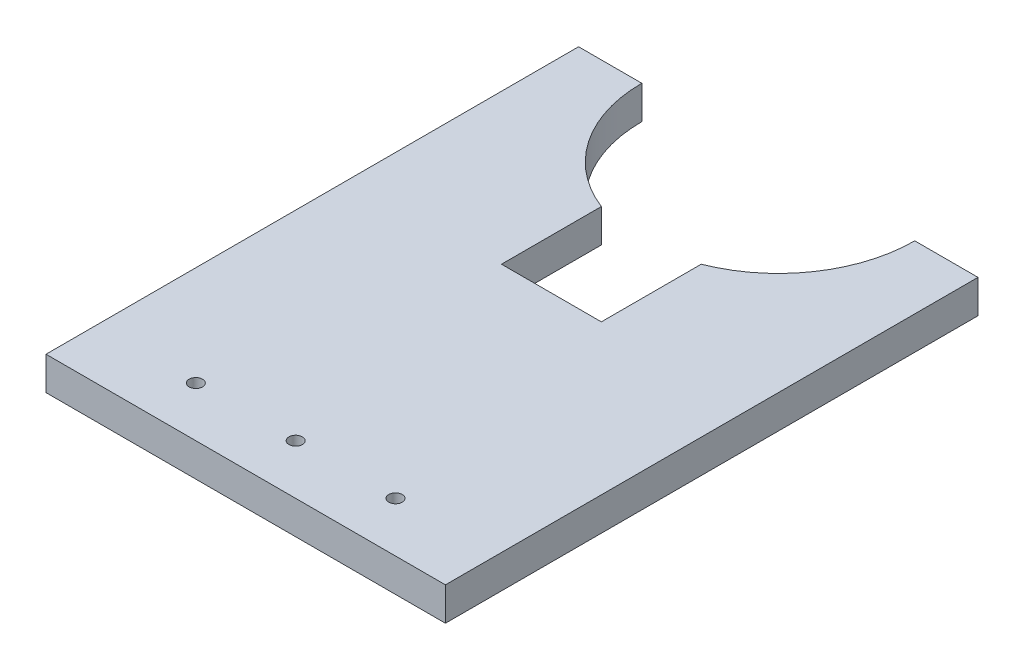
ISO-10303-21;
HEADER;
FILE_DESCRIPTION(('STEP AP214'),'2;1');
FILE_NAME('part.step','',(''),(''),'','','');
FILE_SCHEMA(('AUTOMOTIVE_DESIGN { 1 0 10303 214 1 1 1 1 }'));
ENDSEC;
DATA;
#1=APPLICATION_CONTEXT('core data for automotive mechanical design processes');
#2=APPLICATION_PROTOCOL_DEFINITION('international standard','automotive_design',2000,#1);
#3=PRODUCT_CONTEXT('',#1,'mechanical');
#4=PRODUCT('Part','Part','',(#3));
#5=PRODUCT_RELATED_PRODUCT_CATEGORY('part','',(#4));
#6=PRODUCT_DEFINITION_FORMATION('','',#4);
#7=PRODUCT_DEFINITION_CONTEXT('part definition',#1,'design');
#8=PRODUCT_DEFINITION('design','',#6,#7);
#9=PRODUCT_DEFINITION_SHAPE('','',#8);
#10=(LENGTH_UNIT() NAMED_UNIT(*) SI_UNIT(.MILLI.,.METRE.));
#11=(NAMED_UNIT(*) PLANE_ANGLE_UNIT() SI_UNIT($,.RADIAN.));
#12=(NAMED_UNIT(*) SI_UNIT($,.STERADIAN.) SOLID_ANGLE_UNIT());
#13=UNCERTAINTY_MEASURE_WITH_UNIT(LENGTH_MEASURE(1.E-05),#10,'distance_accuracy_value','');
#14=(GEOMETRIC_REPRESENTATION_CONTEXT(3) GLOBAL_UNCERTAINTY_ASSIGNED_CONTEXT((#13)) GLOBAL_UNIT_ASSIGNED_CONTEXT((#10,
#11,#12)) REPRESENTATION_CONTEXT('',''));
#15=CARTESIAN_POINT('',(0.,0.,0.));
#16=DIRECTION('',(0.,0.,1.));
#17=DIRECTION('',(1.,0.,0.));
#18=AXIS2_PLACEMENT_3D('',#15,#16,#17);
#19=CARTESIAN_POINT('',(0.,12.7,0.));
#20=DIRECTION('',(0.,1.,0.));
#21=DIRECTION('',(0.,0.,1.));
#22=AXIS2_PLACEMENT_3D('',#19,#20,#21);
#23=PLANE('',#22);
#24=CARTESIAN_POINT('',(0.,12.7,-19.05));
#25=DIRECTION('',(0.,1.,0.));
#26=DIRECTION('',(0.,0.,1.));
#27=AXIS2_PLACEMENT_3D('',#24,#25,#26);
#28=CIRCLE('',#27,2.5654);
#29=CARTESIAN_POINT('',(0.,12.7,-16.4846));
#30=VERTEX_POINT('',#29);
#31=EDGE_CURVE('E139',#30,#30,#28,.F.);
#32=ORIENTED_EDGE('',*,*,#31,.T.);
#33=EDGE_LOOP('',(#32));
#34=FACE_BOUND('',#33,.T.);
#35=CARTESIAN_POINT('',(38.1,12.7,-19.05));
#36=DIRECTION('',(0.,1.,0.));
#37=DIRECTION('',(0.,0.,1.));
#38=AXIS2_PLACEMENT_3D('',#35,#36,#37);
#39=CIRCLE('',#38,2.5654);
#40=CARTESIAN_POINT('',(38.1,12.7,-16.4846));
#41=VERTEX_POINT('',#40);
#42=EDGE_CURVE('E191',#41,#41,#39,.F.);
#43=ORIENTED_EDGE('',*,*,#42,.T.);
#44=EDGE_LOOP('',(#43));
#45=FACE_BOUND('',#44,.T.);
#46=CARTESIAN_POINT('',(-38.1,12.7,-19.05));
#47=DIRECTION('',(0.,1.,0.));
#48=DIRECTION('',(0.,0.,1.));
#49=AXIS2_PLACEMENT_3D('',#46,#47,#48);
#50=CIRCLE('',#49,2.5654);
#51=CARTESIAN_POINT('',(-38.1,12.7,-16.4846));
#52=VERTEX_POINT('',#51);
#53=EDGE_CURVE('E194',#52,#52,#50,.F.);
#54=ORIENTED_EDGE('',*,*,#53,.T.);
#55=EDGE_LOOP('',(#54));
#56=FACE_BOUND('',#55,.T.);
#57=DIRECTION('',(0.,0.,1.));
#58=VECTOR('',#57,1.);
#59=CARTESIAN_POINT('',(-76.2,12.7,-203.2));
#60=LINE('',#59,#58);
#61=CARTESIAN_POINT('',(-76.2,12.7,0.));
#62=VERTEX_POINT('',#61);
#63=CARTESIAN_POINT('',(-76.2,12.7,-203.2));
#64=VERTEX_POINT('',#63);
#65=EDGE_CURVE('E145',#62,#64,#60,.F.);
#66=ORIENTED_EDGE('',*,*,#65,.F.);
#67=DIRECTION('',(1.,0.,0.));
#68=VECTOR('',#67,1.);
#69=CARTESIAN_POINT('',(-76.2,12.7,0.));
#70=LINE('',#69,#68);
#71=CARTESIAN_POINT('',(76.2,12.7,0.));
#72=VERTEX_POINT('',#71);
#73=EDGE_CURVE('E157',#72,#62,#70,.F.);
#74=ORIENTED_EDGE('',*,*,#73,.F.);
#75=DIRECTION('',(0.,0.,-1.));
#76=VECTOR('',#75,1.);
#77=CARTESIAN_POINT('',(76.2,12.7,0.));
#78=LINE('',#77,#76);
#79=CARTESIAN_POINT('',(76.2,12.7,-203.2));
#80=VERTEX_POINT('',#79);
#81=EDGE_CURVE('E134',#80,#72,#78,.F.);
#82=ORIENTED_EDGE('',*,*,#81,.F.);
#83=DIRECTION('',(-1.,0.,0.));
#84=VECTOR('',#83,1.);
#85=CARTESIAN_POINT('',(76.2,12.7,-203.2));
#86=LINE('',#85,#84);
#87=CARTESIAN_POINT('',(52.07,12.7,-203.2));
#88=VERTEX_POINT('',#87);
#89=EDGE_CURVE('E90',#88,#80,#86,.F.);
#90=ORIENTED_EDGE('',*,*,#89,.F.);
#91=CARTESIAN_POINT('',(0.,12.7,-203.2));
#92=DIRECTION('',(0.,1.,0.));
#93=DIRECTION('',(0.,0.,1.));
#94=AXIS2_PLACEMENT_3D('',#91,#92,#93);
#95=CIRCLE('',#94,52.07);
#96=CARTESIAN_POINT('',(19.05,12.7,-154.739888568019));
#97=VERTEX_POINT('',#96);
#98=EDGE_CURVE('E19',#88,#97,#95,.F.);
#99=ORIENTED_EDGE('',*,*,#98,.T.);
#100=DIRECTION('',(0.,0.,1.));
#101=VECTOR('',#100,1.);
#102=CARTESIAN_POINT('',(19.05,12.7,-154.739888568019));
#103=LINE('',#102,#101);
#104=CARTESIAN_POINT('',(19.05,12.7,-116.639888568019));
#105=VERTEX_POINT('',#104);
#106=EDGE_CURVE('E96',#105,#97,#103,.F.);
#107=ORIENTED_EDGE('',*,*,#106,.F.);
#108=DIRECTION('',(-1.,0.,0.));
#109=VECTOR('',#108,1.);
#110=CARTESIAN_POINT('',(19.05,12.7,-116.639888568019));
#111=LINE('',#110,#109);
#112=CARTESIAN_POINT('',(-19.05,12.7,-116.639888568019));
#113=VERTEX_POINT('',#112);
#114=EDGE_CURVE('E113',#113,#105,#111,.F.);
#115=ORIENTED_EDGE('',*,*,#114,.F.);
#116=DIRECTION('',(0.,0.,-1.));
#117=VECTOR('',#116,1.);
#118=CARTESIAN_POINT('',(-19.05,12.7,-116.639888568019));
#119=LINE('',#118,#117);
#120=CARTESIAN_POINT('',(-19.05,12.7,-154.739888568019));
#121=VERTEX_POINT('',#120);
#122=EDGE_CURVE('E161',#121,#113,#119,.F.);
#123=ORIENTED_EDGE('',*,*,#122,.F.);
#124=CARTESIAN_POINT('',(0.,12.7,-203.2));
#125=DIRECTION('',(0.,1.,0.));
#126=DIRECTION('',(0.,0.,1.));
#127=AXIS2_PLACEMENT_3D('',#124,#125,#126);
#128=CIRCLE('',#127,52.07);
#129=CARTESIAN_POINT('',(-52.07,12.7,-203.2));
#130=VERTEX_POINT('',#129);
#131=EDGE_CURVE('E151',#121,#130,#128,.F.);
#132=ORIENTED_EDGE('',*,*,#131,.T.);
#133=DIRECTION('',(-1.,0.,0.));
#134=VECTOR('',#133,1.);
#135=CARTESIAN_POINT('',(-52.07,12.7,-203.2));
#136=LINE('',#135,#134);
#137=EDGE_CURVE('E149',#64,#130,#136,.F.);
#138=ORIENTED_EDGE('',*,*,#137,.F.);
#139=EDGE_LOOP('',(#66,#74,#82,#90,#99,#107,#115,#123,#132,#138));
#140=FACE_BOUND('',#139,.T.);
#141=ADVANCED_FACE('F16',(#34,#45,#56,#140),#23,.T.);
#142=CARTESIAN_POINT('',(-76.2,0.,0.));
#143=DIRECTION('',(0.,0.,1.));
#144=DIRECTION('',(1.,0.,0.));
#145=AXIS2_PLACEMENT_3D('',#142,#143,#144);
#146=PLANE('',#145);
#147=DIRECTION('',(0.,1.,0.));
#148=VECTOR('',#147,1.);
#149=CARTESIAN_POINT('',(-76.2,0.,0.));
#150=LINE('',#149,#148);
#151=CARTESIAN_POINT('',(-76.2,0.,0.));
#152=VERTEX_POINT('',#151);
#153=EDGE_CURVE('E142',#152,#62,#150,.T.);
#154=ORIENTED_EDGE('',*,*,#153,.F.);
#155=DIRECTION('',(1.,0.,0.));
#156=VECTOR('',#155,1.);
#157=CARTESIAN_POINT('',(0.,0.,0.));
#158=LINE('',#157,#156);
#159=CARTESIAN_POINT('',(76.2,0.,0.));
#160=VERTEX_POINT('',#159);
#161=EDGE_CURVE('E129',#152,#160,#158,.T.);
#162=ORIENTED_EDGE('',*,*,#161,.T.);
#163=DIRECTION('',(0.,1.,0.));
#164=VECTOR('',#163,1.);
#165=CARTESIAN_POINT('',(76.2,0.,0.));
#166=LINE('',#165,#164);
#167=EDGE_CURVE('E132',#72,#160,#166,.F.);
#168=ORIENTED_EDGE('',*,*,#167,.F.);
#169=ORIENTED_EDGE('',*,*,#73,.T.);
#170=EDGE_LOOP('',(#154,#162,#168,#169));
#171=FACE_BOUND('',#170,.T.);
#172=ADVANCED_FACE('F253',(#171),#146,.T.);
#173=CARTESIAN_POINT('',(76.2,0.,0.));
#174=DIRECTION('',(1.,0.,0.));
#175=DIRECTION('',(0.,0.,-1.));
#176=AXIS2_PLACEMENT_3D('',#173,#174,#175);
#177=PLANE('',#176);
#178=ORIENTED_EDGE('',*,*,#167,.T.);
#179=DIRECTION('',(0.,0.,1.));
#180=VECTOR('',#179,1.);
#181=CARTESIAN_POINT('',(76.2,0.,0.));
#182=LINE('',#181,#180);
#183=CARTESIAN_POINT('',(76.2,0.,-203.2));
#184=VERTEX_POINT('',#183);
#185=EDGE_CURVE('E125',#160,#184,#182,.F.);
#186=ORIENTED_EDGE('',*,*,#185,.T.);
#187=DIRECTION('',(0.,1.,0.));
#188=VECTOR('',#187,1.);
#189=CARTESIAN_POINT('',(76.2,0.,-203.2));
#190=LINE('',#189,#188);
#191=EDGE_CURVE('E121',#80,#184,#190,.F.);
#192=ORIENTED_EDGE('',*,*,#191,.F.);
#193=ORIENTED_EDGE('',*,*,#81,.T.);
#194=EDGE_LOOP('',(#178,#186,#192,#193));
#195=FACE_BOUND('',#194,.T.);
#196=ADVANCED_FACE('F258',(#195),#177,.T.);
#197=CARTESIAN_POINT('',(76.2,0.,-203.2));
#198=DIRECTION('',(0.,0.,-1.));
#199=DIRECTION('',(-1.,0.,0.));
#200=AXIS2_PLACEMENT_3D('',#197,#198,#199);
#201=PLANE('',#200);
#202=ORIENTED_EDGE('',*,*,#191,.T.);
#203=DIRECTION('',(1.,0.,0.));
#204=VECTOR('',#203,1.);
#205=CARTESIAN_POINT('',(0.,0.,-203.2));
#206=LINE('',#205,#204);
#207=CARTESIAN_POINT('',(52.07,0.,-203.2));
#208=VERTEX_POINT('',#207);
#209=EDGE_CURVE('E128',#184,#208,#206,.F.);
#210=ORIENTED_EDGE('',*,*,#209,.T.);
#211=DIRECTION('',(0.,1.,0.));
#212=VECTOR('',#211,1.);
#213=CARTESIAN_POINT('',(52.07,0.,-203.2));
#214=LINE('',#213,#212);
#215=EDGE_CURVE('E108',#208,#88,#214,.T.);
#216=ORIENTED_EDGE('',*,*,#215,.T.);
#217=ORIENTED_EDGE('',*,*,#89,.T.);
#218=EDGE_LOOP('',(#202,#210,#216,#217));
#219=FACE_BOUND('',#218,.T.);
#220=ADVANCED_FACE('F260',(#219),#201,.T.);
#221=CARTESIAN_POINT('',(0.,0.,-203.2));
#222=DIRECTION('',(0.,1.,0.));
#223=DIRECTION('',(0.,0.,1.));
#224=AXIS2_PLACEMENT_3D('',#221,#222,#223);
#225=CYLINDRICAL_SURFACE('',#224,52.07);
#226=ORIENTED_EDGE('',*,*,#98,.F.);
#227=ORIENTED_EDGE('',*,*,#215,.F.);
#228=CARTESIAN_POINT('',(0.,0.,-203.2));
#229=DIRECTION('',(0.,1.,0.));
#230=DIRECTION('',(0.,0.,1.));
#231=AXIS2_PLACEMENT_3D('',#228,#229,#230);
#232=CIRCLE('',#231,52.07);
#233=CARTESIAN_POINT('',(19.05,0.,-154.739888568019));
#234=VERTEX_POINT('',#233);
#235=EDGE_CURVE('E112',#208,#234,#232,.F.);
#236=ORIENTED_EDGE('',*,*,#235,.T.);
#237=DIRECTION('',(0.,1.,0.));
#238=VECTOR('',#237,1.);
#239=CARTESIAN_POINT('',(19.05,0.,-154.739888568019));
#240=LINE('',#239,#238);
#241=EDGE_CURVE('E100',#97,#234,#240,.F.);
#242=ORIENTED_EDGE('',*,*,#241,.F.);
#243=EDGE_LOOP('',(#226,#227,#236,#242));
#244=FACE_BOUND('',#243,.T.);
#245=ADVANCED_FACE('F110',(#244),#225,.F.);
#246=CARTESIAN_POINT('',(19.05,0.,-154.739888568019));
#247=DIRECTION('',(-1.,0.,0.));
#248=DIRECTION('',(0.,0.,1.));
#249=AXIS2_PLACEMENT_3D('',#246,#247,#248);
#250=PLANE('',#249);
#251=ORIENTED_EDGE('',*,*,#241,.T.);
#252=DIRECTION('',(0.,0.,1.));
#253=VECTOR('',#252,1.);
#254=CARTESIAN_POINT('',(19.05,0.,0.));
#255=LINE('',#254,#253);
#256=CARTESIAN_POINT('',(19.05,0.,-116.639888568019));
#257=VERTEX_POINT('',#256);
#258=EDGE_CURVE('E188',#234,#257,#255,.T.);
#259=ORIENTED_EDGE('',*,*,#258,.T.);
#260=DIRECTION('',(0.,1.,0.));
#261=VECTOR('',#260,1.);
#262=CARTESIAN_POINT('',(19.05,0.,-116.639888568019));
#263=LINE('',#262,#261);
#264=EDGE_CURVE('E102',#105,#257,#263,.F.);
#265=ORIENTED_EDGE('',*,*,#264,.F.);
#266=ORIENTED_EDGE('',*,*,#106,.T.);
#267=EDGE_LOOP('',(#251,#259,#265,#266));
#268=FACE_BOUND('',#267,.T.);
#269=ADVANCED_FACE('F97',(#268),#250,.T.);
#270=CARTESIAN_POINT('',(19.05,0.,-116.639888568019));
#271=DIRECTION('',(0.,0.,-1.));
#272=DIRECTION('',(-1.,0.,0.));
#273=AXIS2_PLACEMENT_3D('',#270,#271,#272);
#274=PLANE('',#273);
#275=ORIENTED_EDGE('',*,*,#264,.T.);
#276=DIRECTION('',(1.,0.,0.));
#277=VECTOR('',#276,1.);
#278=CARTESIAN_POINT('',(0.,0.,-116.639888568019));
#279=LINE('',#278,#277);
#280=CARTESIAN_POINT('',(-19.05,0.,-116.639888568019));
#281=VERTEX_POINT('',#280);
#282=EDGE_CURVE('E212',#257,#281,#279,.F.);
#283=ORIENTED_EDGE('',*,*,#282,.T.);
#284=DIRECTION('',(0.,1.,0.));
#285=VECTOR('',#284,1.);
#286=CARTESIAN_POINT('',(-19.05,0.,-116.639888568019));
#287=LINE('',#286,#285);
#288=EDGE_CURVE('E163',#113,#281,#287,.F.);
#289=ORIENTED_EDGE('',*,*,#288,.F.);
#290=ORIENTED_EDGE('',*,*,#114,.T.);
#291=EDGE_LOOP('',(#275,#283,#289,#290));
#292=FACE_BOUND('',#291,.T.);
#293=ADVANCED_FACE('F218',(#292),#274,.T.);
#294=CARTESIAN_POINT('',(-19.05,0.,-116.639888568019));
#295=DIRECTION('',(1.,0.,0.));
#296=DIRECTION('',(0.,0.,-1.));
#297=AXIS2_PLACEMENT_3D('',#294,#295,#296);
#298=PLANE('',#297);
#299=ORIENTED_EDGE('',*,*,#288,.T.);
#300=DIRECTION('',(0.,0.,1.));
#301=VECTOR('',#300,1.);
#302=CARTESIAN_POINT('',(-19.05,0.,0.));
#303=LINE('',#302,#301);
#304=CARTESIAN_POINT('',(-19.05,0.,-154.739888568019));
#305=VERTEX_POINT('',#304);
#306=EDGE_CURVE('E186',#281,#305,#303,.F.);
#307=ORIENTED_EDGE('',*,*,#306,.T.);
#308=DIRECTION('',(0.,1.,0.));
#309=VECTOR('',#308,1.);
#310=CARTESIAN_POINT('',(-19.05,0.,-154.739888568019));
#311=LINE('',#310,#309);
#312=EDGE_CURVE('E197',#305,#121,#311,.T.);
#313=ORIENTED_EDGE('',*,*,#312,.T.);
#314=ORIENTED_EDGE('',*,*,#122,.T.);
#315=EDGE_LOOP('',(#299,#307,#313,#314));
#316=FACE_BOUND('',#315,.T.);
#317=ADVANCED_FACE('F244',(#316),#298,.T.);
#318=CARTESIAN_POINT('',(0.,0.,-203.2));
#319=DIRECTION('',(0.,1.,0.));
#320=DIRECTION('',(0.,0.,1.));
#321=AXIS2_PLACEMENT_3D('',#318,#319,#320);
#322=CYLINDRICAL_SURFACE('',#321,52.07);
#323=ORIENTED_EDGE('',*,*,#131,.F.);
#324=ORIENTED_EDGE('',*,*,#312,.F.);
#325=CARTESIAN_POINT('',(0.,0.,-203.2));
#326=DIRECTION('',(0.,1.,0.));
#327=DIRECTION('',(0.,0.,1.));
#328=AXIS2_PLACEMENT_3D('',#325,#326,#327);
#329=CIRCLE('',#328,52.07);
#330=CARTESIAN_POINT('',(-52.07,0.,-203.2));
#331=VERTEX_POINT('',#330);
#332=EDGE_CURVE('E182',#305,#331,#329,.F.);
#333=ORIENTED_EDGE('',*,*,#332,.T.);
#334=DIRECTION('',(0.,1.,0.));
#335=VECTOR('',#334,1.);
#336=CARTESIAN_POINT('',(-52.07,0.,-203.2));
#337=LINE('',#336,#335);
#338=EDGE_CURVE('E146',#130,#331,#337,.F.);
#339=ORIENTED_EDGE('',*,*,#338,.F.);
#340=EDGE_LOOP('',(#323,#324,#333,#339));
#341=FACE_BOUND('',#340,.T.);
#342=ADVANCED_FACE('F246',(#341),#322,.F.);
#343=CARTESIAN_POINT('',(-52.07,0.,-203.2));
#344=DIRECTION('',(0.,0.,-1.));
#345=DIRECTION('',(-1.,0.,0.));
#346=AXIS2_PLACEMENT_3D('',#343,#344,#345);
#347=PLANE('',#346);
#348=ORIENTED_EDGE('',*,*,#338,.T.);
#349=DIRECTION('',(1.,0.,0.));
#350=VECTOR('',#349,1.);
#351=CARTESIAN_POINT('',(0.,0.,-203.2));
#352=LINE('',#351,#350);
#353=CARTESIAN_POINT('',(-76.2,0.,-203.2));
#354=VERTEX_POINT('',#353);
#355=EDGE_CURVE('E185',#331,#354,#352,.F.);
#356=ORIENTED_EDGE('',*,*,#355,.T.);
#357=DIRECTION('',(0.,1.,0.));
#358=VECTOR('',#357,1.);
#359=CARTESIAN_POINT('',(-76.2,0.,-203.2));
#360=LINE('',#359,#358);
#361=EDGE_CURVE('E34',#64,#354,#360,.F.);
#362=ORIENTED_EDGE('',*,*,#361,.F.);
#363=ORIENTED_EDGE('',*,*,#137,.T.);
#364=EDGE_LOOP('',(#348,#356,#362,#363));
#365=FACE_BOUND('',#364,.T.);
#366=ADVANCED_FACE('F247',(#365),#347,.T.);
#367=CARTESIAN_POINT('',(-76.2,0.,-203.2));
#368=DIRECTION('',(-1.,0.,0.));
#369=DIRECTION('',(0.,0.,1.));
#370=AXIS2_PLACEMENT_3D('',#367,#368,#369);
#371=PLANE('',#370);
#372=ORIENTED_EDGE('',*,*,#361,.T.);
#373=DIRECTION('',(0.,0.,1.));
#374=VECTOR('',#373,1.);
#375=CARTESIAN_POINT('',(-76.2,0.,0.));
#376=LINE('',#375,#374);
#377=EDGE_CURVE('E181',#354,#152,#376,.T.);
#378=ORIENTED_EDGE('',*,*,#377,.T.);
#379=ORIENTED_EDGE('',*,*,#153,.T.);
#380=ORIENTED_EDGE('',*,*,#65,.T.);
#381=EDGE_LOOP('',(#372,#378,#379,#380));
#382=FACE_BOUND('',#381,.T.);
#383=ADVANCED_FACE('F255',(#382),#371,.T.);
#384=CARTESIAN_POINT('',(-38.1,12.7,-19.05));
#385=DIRECTION('',(0.,1.,0.));
#386=DIRECTION('',(0.,0.,1.));
#387=AXIS2_PLACEMENT_3D('',#384,#385,#386);
#388=CYLINDRICAL_SURFACE('',#387,2.5654);
#389=ORIENTED_EDGE('',*,*,#53,.F.);
#390=EDGE_LOOP('',(#389));
#391=FACE_BOUND('',#390,.T.);
#392=CARTESIAN_POINT('',(-38.1,0.,-19.05));
#393=DIRECTION('',(0.,1.,0.));
#394=DIRECTION('',(0.,0.,1.));
#395=AXIS2_PLACEMENT_3D('',#392,#393,#394);
#396=CIRCLE('',#395,2.5654);
#397=CARTESIAN_POINT('',(-38.1,0.,-16.4846));
#398=VERTEX_POINT('',#397);
#399=EDGE_CURVE('E178',#398,#398,#396,.F.);
#400=ORIENTED_EDGE('',*,*,#399,.T.);
#401=EDGE_LOOP('',(#400));
#402=FACE_BOUND('',#401,.T.);
#403=ADVANCED_FACE('F285',(#391,#402),#388,.F.);
#404=CARTESIAN_POINT('',(38.1,12.7,-19.05));
#405=DIRECTION('',(0.,1.,0.));
#406=DIRECTION('',(0.,0.,1.));
#407=AXIS2_PLACEMENT_3D('',#404,#405,#406);
#408=CYLINDRICAL_SURFACE('',#407,2.5654);
#409=ORIENTED_EDGE('',*,*,#42,.F.);
#410=EDGE_LOOP('',(#409));
#411=FACE_BOUND('',#410,.T.);
#412=CARTESIAN_POINT('',(38.1,0.,-19.05));
#413=DIRECTION('',(0.,1.,0.));
#414=DIRECTION('',(0.,0.,1.));
#415=AXIS2_PLACEMENT_3D('',#412,#413,#414);
#416=CIRCLE('',#415,2.5654);
#417=CARTESIAN_POINT('',(38.1,0.,-16.4846));
#418=VERTEX_POINT('',#417);
#419=EDGE_CURVE('E25',#418,#418,#416,.F.);
#420=ORIENTED_EDGE('',*,*,#419,.T.);
#421=EDGE_LOOP('',(#420));
#422=FACE_BOUND('',#421,.T.);
#423=ADVANCED_FACE('F277',(#411,#422),#408,.F.);
#424=CARTESIAN_POINT('',(0.,12.7,-19.05));
#425=DIRECTION('',(0.,1.,0.));
#426=DIRECTION('',(0.,0.,1.));
#427=AXIS2_PLACEMENT_3D('',#424,#425,#426);
#428=CYLINDRICAL_SURFACE('',#427,2.5654);
#429=ORIENTED_EDGE('',*,*,#31,.F.);
#430=EDGE_LOOP('',(#429));
#431=FACE_BOUND('',#430,.T.);
#432=CARTESIAN_POINT('',(0.,0.,-19.05));
#433=DIRECTION('',(0.,1.,0.));
#434=DIRECTION('',(0.,0.,1.));
#435=AXIS2_PLACEMENT_3D('',#432,#433,#434);
#436=CIRCLE('',#435,2.5654);
#437=CARTESIAN_POINT('',(0.,0.,-16.4846));
#438=VERTEX_POINT('',#437);
#439=EDGE_CURVE('E11',#438,#438,#436,.F.);
#440=ORIENTED_EDGE('',*,*,#439,.T.);
#441=EDGE_LOOP('',(#440));
#442=FACE_BOUND('',#441,.T.);
#443=ADVANCED_FACE('F271',(#431,#442),#428,.F.);
#444=CARTESIAN_POINT('',(0.,0.,0.));
#445=DIRECTION('',(0.,1.,0.));
#446=DIRECTION('',(0.,0.,1.));
#447=AXIS2_PLACEMENT_3D('',#444,#445,#446);
#448=PLANE('',#447);
#449=ORIENTED_EDGE('',*,*,#439,.F.);
#450=EDGE_LOOP('',(#449));
#451=FACE_BOUND('',#450,.T.);
#452=ORIENTED_EDGE('',*,*,#419,.F.);
#453=EDGE_LOOP('',(#452));
#454=FACE_BOUND('',#453,.T.);
#455=ORIENTED_EDGE('',*,*,#399,.F.);
#456=EDGE_LOOP('',(#455));
#457=FACE_BOUND('',#456,.T.);
#458=ORIENTED_EDGE('',*,*,#355,.F.);
#459=ORIENTED_EDGE('',*,*,#332,.F.);
#460=ORIENTED_EDGE('',*,*,#306,.F.);
#461=ORIENTED_EDGE('',*,*,#282,.F.);
#462=ORIENTED_EDGE('',*,*,#258,.F.);
#463=ORIENTED_EDGE('',*,*,#235,.F.);
#464=ORIENTED_EDGE('',*,*,#209,.F.);
#465=ORIENTED_EDGE('',*,*,#185,.F.);
#466=ORIENTED_EDGE('',*,*,#161,.F.);
#467=ORIENTED_EDGE('',*,*,#377,.F.);
#468=EDGE_LOOP('',(#458,#459,#460,#461,#462,#463,#464,#465,#466,#467));
#469=FACE_BOUND('',#468,.T.);
#470=ADVANCED_FACE('F223',(#451,#454,#457,#469),#448,.F.);
#471=CLOSED_SHELL('',(#141,#172,#196,#220,#245,#269,#293,#317,#342,#366,#383,#403,#423,#443,#470));
#472=MANIFOLD_SOLID_BREP('B1',#471);
#473=ADVANCED_BREP_SHAPE_REPRESENTATION('',(#18,#472),#14);
#474=SHAPE_DEFINITION_REPRESENTATION(#9,#473);
ENDSEC;
END-ISO-10303-21;
